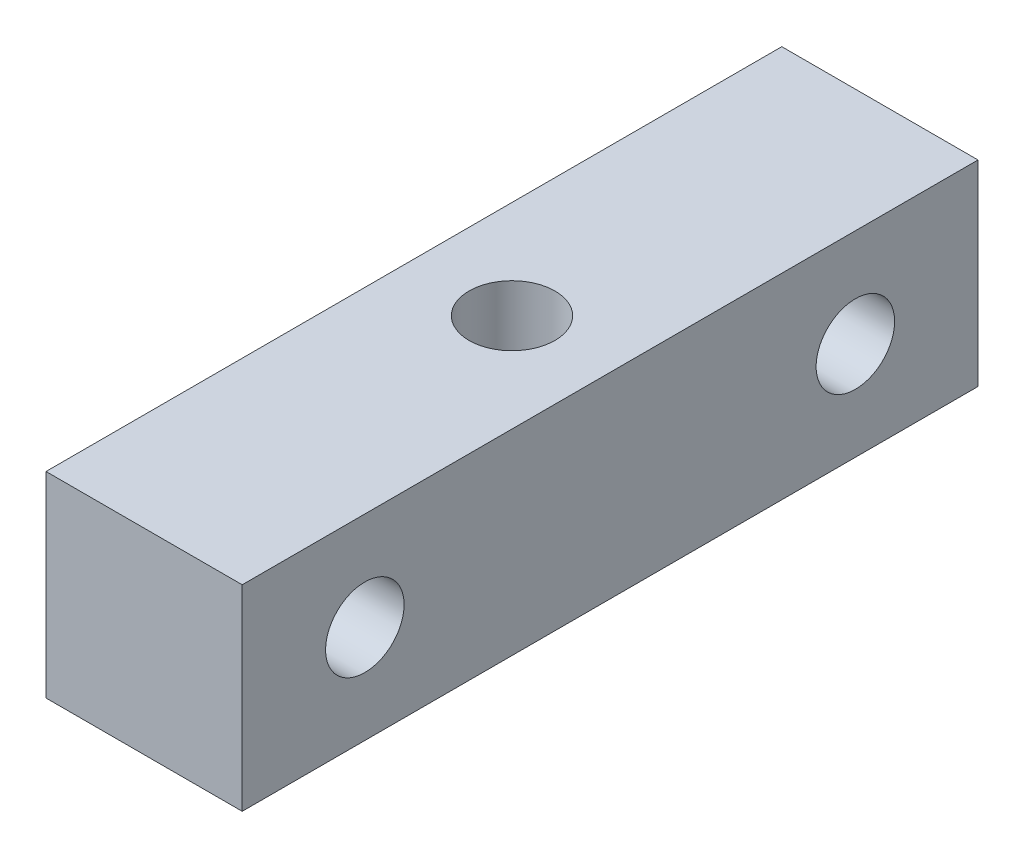
ISO-10303-21;
HEADER;
FILE_DESCRIPTION(('STEP AP214'),'2;1');
FILE_NAME('part.step','',(''),(''),'','','');
FILE_SCHEMA(('AUTOMOTIVE_DESIGN { 1 0 10303 214 1 1 1 1 }'));
ENDSEC;
DATA;
#1=APPLICATION_CONTEXT('core data for automotive mechanical design processes');
#2=APPLICATION_PROTOCOL_DEFINITION('international standard','automotive_design',2000,#1);
#3=PRODUCT_CONTEXT('',#1,'mechanical');
#4=PRODUCT('Part','Part','',(#3));
#5=PRODUCT_RELATED_PRODUCT_CATEGORY('part','',(#4));
#6=PRODUCT_DEFINITION_FORMATION('','',#4);
#7=PRODUCT_DEFINITION_CONTEXT('part definition',#1,'design');
#8=PRODUCT_DEFINITION('design','',#6,#7);
#9=PRODUCT_DEFINITION_SHAPE('','',#8);
#10=(LENGTH_UNIT() NAMED_UNIT(*) SI_UNIT(.MILLI.,.METRE.));
#11=(NAMED_UNIT(*) PLANE_ANGLE_UNIT() SI_UNIT($,.RADIAN.));
#12=(NAMED_UNIT(*) SI_UNIT($,.STERADIAN.) SOLID_ANGLE_UNIT());
#13=UNCERTAINTY_MEASURE_WITH_UNIT(LENGTH_MEASURE(1.E-05),#10,'distance_accuracy_value','');
#14=(GEOMETRIC_REPRESENTATION_CONTEXT(3) GLOBAL_UNCERTAINTY_ASSIGNED_CONTEXT((#13)) GLOBAL_UNIT_ASSIGNED_CONTEXT((#10,
#11,#12)) REPRESENTATION_CONTEXT('',''));
#15=CARTESIAN_POINT('',(0.,0.,0.));
#16=DIRECTION('',(0.,0.,1.));
#17=DIRECTION('',(1.,0.,0.));
#18=AXIS2_PLACEMENT_3D('',#15,#16,#17);
#19=CARTESIAN_POINT('',(4.,-4.,30.));
#20=DIRECTION('',(-1.,0.,0.));
#21=DIRECTION('',(0.,0.,1.));
#22=AXIS2_PLACEMENT_3D('',#19,#20,#21);
#23=PLANE('',#22);
#24=CARTESIAN_POINT('',(4.,0.,25.));
#25=DIRECTION('',(1.,0.,0.));
#26=DIRECTION('',(0.,0.,-1.));
#27=AXIS2_PLACEMENT_3D('',#24,#25,#26);
#28=CIRCLE('',#27,1.6);
#29=CARTESIAN_POINT('',(4.,0.,23.4));
#30=VERTEX_POINT('',#29);
#31=EDGE_CURVE('E149',#30,#30,#28,.T.);
#32=ORIENTED_EDGE('',*,*,#31,.F.);
#33=EDGE_LOOP('',(#32));
#34=FACE_BOUND('',#33,.T.);
#35=CARTESIAN_POINT('',(4.,0.,5.));
#36=DIRECTION('',(1.,0.,0.));
#37=DIRECTION('',(0.,0.,-1.));
#38=AXIS2_PLACEMENT_3D('',#35,#36,#37);
#39=CIRCLE('',#38,1.6);
#40=CARTESIAN_POINT('',(4.,0.,3.4));
#41=VERTEX_POINT('',#40);
#42=EDGE_CURVE('E145',#41,#41,#39,.T.);
#43=ORIENTED_EDGE('',*,*,#42,.F.);
#44=EDGE_LOOP('',(#43));
#45=FACE_BOUND('',#44,.T.);
#46=DIRECTION('',(0.,1.,0.));
#47=VECTOR('',#46,1.);
#48=CARTESIAN_POINT('',(4.,-4.,0.));
#49=LINE('',#48,#47);
#50=CARTESIAN_POINT('',(4.,-4.,0.));
#51=VERTEX_POINT('',#50);
#52=CARTESIAN_POINT('',(4.,4.,0.));
#53=VERTEX_POINT('',#52);
#54=EDGE_CURVE('E112',#51,#53,#49,.T.);
#55=ORIENTED_EDGE('',*,*,#54,.T.);
#56=DIRECTION('',(0.,0.,-1.));
#57=VECTOR('',#56,1.);
#58=CARTESIAN_POINT('',(4.,4.,30.));
#59=LINE('',#58,#57);
#60=CARTESIAN_POINT('',(4.,4.,30.));
#61=VERTEX_POINT('',#60);
#62=EDGE_CURVE('E11',#61,#53,#59,.T.);
#63=ORIENTED_EDGE('',*,*,#62,.F.);
#64=DIRECTION('',(0.,1.,0.));
#65=VECTOR('',#64,1.);
#66=CARTESIAN_POINT('',(4.,-4.,30.));
#67=LINE('',#66,#65);
#68=CARTESIAN_POINT('',(4.,-4.,30.));
#69=VERTEX_POINT('',#68);
#70=EDGE_CURVE('E96',#69,#61,#67,.T.);
#71=ORIENTED_EDGE('',*,*,#70,.F.);
#72=DIRECTION('',(0.,0.,-1.));
#73=VECTOR('',#72,1.);
#74=CARTESIAN_POINT('',(4.,-4.,30.));
#75=LINE('',#74,#73);
#76=EDGE_CURVE('E108',#69,#51,#75,.T.);
#77=ORIENTED_EDGE('',*,*,#76,.T.);
#78=EDGE_LOOP('',(#55,#63,#71,#77));
#79=FACE_BOUND('',#78,.T.);
#80=ADVANCED_FACE('F44',(#34,#45,#79),#23,.F.);
#81=CARTESIAN_POINT('',(-4.,4.,30.));
#82=DIRECTION('',(0.,-1.,0.));
#83=DIRECTION('',(0.,0.,-1.));
#84=AXIS2_PLACEMENT_3D('',#81,#82,#83);
#85=PLANE('',#84);
#86=CARTESIAN_POINT('',(0.,4.,15.));
#87=DIRECTION('',(0.,1.,0.));
#88=DIRECTION('',(0.,0.,1.));
#89=AXIS2_PLACEMENT_3D('',#86,#87,#88);
#90=CIRCLE('',#89,1.75);
#91=CARTESIAN_POINT('',(0.,4.,16.75));
#92=VERTEX_POINT('',#91);
#93=EDGE_CURVE('E133',#92,#92,#90,.T.);
#94=ORIENTED_EDGE('',*,*,#93,.F.);
#95=EDGE_LOOP('',(#94));
#96=FACE_BOUND('',#95,.T.);
#97=DIRECTION('',(-1.,0.,0.));
#98=VECTOR('',#97,1.);
#99=CARTESIAN_POINT('',(-4.,4.,0.));
#100=LINE('',#99,#98);
#101=CARTESIAN_POINT('',(-4.,4.,0.));
#102=VERTEX_POINT('',#101);
#103=EDGE_CURVE('E101',#53,#102,#100,.T.);
#104=ORIENTED_EDGE('',*,*,#103,.T.);
#105=DIRECTION('',(0.,0.,-1.));
#106=VECTOR('',#105,1.);
#107=CARTESIAN_POINT('',(-4.,4.,30.));
#108=LINE('',#107,#106);
#109=CARTESIAN_POINT('',(-4.,4.,30.));
#110=VERTEX_POINT('',#109);
#111=EDGE_CURVE('E53',#110,#102,#108,.T.);
#112=ORIENTED_EDGE('',*,*,#111,.F.);
#113=DIRECTION('',(-1.,0.,0.));
#114=VECTOR('',#113,1.);
#115=CARTESIAN_POINT('',(-4.,4.,30.));
#116=LINE('',#115,#114);
#117=EDGE_CURVE('E91',#61,#110,#116,.T.);
#118=ORIENTED_EDGE('',*,*,#117,.F.);
#119=ORIENTED_EDGE('',*,*,#62,.T.);
#120=EDGE_LOOP('',(#104,#112,#118,#119));
#121=FACE_BOUND('',#120,.T.);
#122=ADVANCED_FACE('F100',(#96,#121),#85,.F.);
#123=CARTESIAN_POINT('',(-4.,-4.,30.));
#124=DIRECTION('',(1.,0.,0.));
#125=DIRECTION('',(0.,0.,-1.));
#126=AXIS2_PLACEMENT_3D('',#123,#124,#125);
#127=PLANE('',#126);
#128=CARTESIAN_POINT('',(-4.,0.,25.));
#129=DIRECTION('',(1.,0.,0.));
#130=DIRECTION('',(0.,0.,-1.));
#131=AXIS2_PLACEMENT_3D('',#128,#129,#130);
#132=CIRCLE('',#131,1.6);
#133=CARTESIAN_POINT('',(-4.,0.,23.4));
#134=VERTEX_POINT('',#133);
#135=EDGE_CURVE('E137',#134,#134,#132,.T.);
#136=ORIENTED_EDGE('',*,*,#135,.T.);
#137=EDGE_LOOP('',(#136));
#138=FACE_BOUND('',#137,.T.);
#139=CARTESIAN_POINT('',(-4.,0.,5.));
#140=DIRECTION('',(1.,0.,0.));
#141=DIRECTION('',(0.,0.,-1.));
#142=AXIS2_PLACEMENT_3D('',#139,#140,#141);
#143=CIRCLE('',#142,1.6);
#144=CARTESIAN_POINT('',(-4.,0.,3.4));
#145=VERTEX_POINT('',#144);
#146=EDGE_CURVE('E141',#145,#145,#143,.T.);
#147=ORIENTED_EDGE('',*,*,#146,.T.);
#148=EDGE_LOOP('',(#147));
#149=FACE_BOUND('',#148,.T.);
#150=DIRECTION('',(0.,-1.,0.));
#151=VECTOR('',#150,1.);
#152=CARTESIAN_POINT('',(-4.,-4.,0.));
#153=LINE('',#152,#151);
#154=CARTESIAN_POINT('',(-4.,-4.,0.));
#155=VERTEX_POINT('',#154);
#156=EDGE_CURVE('E78',#102,#155,#153,.T.);
#157=ORIENTED_EDGE('',*,*,#156,.T.);
#158=DIRECTION('',(0.,0.,-1.));
#159=VECTOR('',#158,1.);
#160=CARTESIAN_POINT('',(-4.,-4.,30.));
#161=LINE('',#160,#159);
#162=CARTESIAN_POINT('',(-4.,-4.,30.));
#163=VERTEX_POINT('',#162);
#164=EDGE_CURVE('E103',#163,#155,#161,.T.);
#165=ORIENTED_EDGE('',*,*,#164,.F.);
#166=DIRECTION('',(0.,-1.,0.));
#167=VECTOR('',#166,1.);
#168=CARTESIAN_POINT('',(-4.,-4.,30.));
#169=LINE('',#168,#167);
#170=EDGE_CURVE('E94',#110,#163,#169,.T.);
#171=ORIENTED_EDGE('',*,*,#170,.F.);
#172=ORIENTED_EDGE('',*,*,#111,.T.);
#173=EDGE_LOOP('',(#157,#165,#171,#172));
#174=FACE_BOUND('',#173,.T.);
#175=ADVANCED_FACE('F104',(#138,#149,#174),#127,.F.);
#176=CARTESIAN_POINT('',(-4.,-4.,30.));
#177=DIRECTION('',(0.,1.,0.));
#178=DIRECTION('',(0.,0.,1.));
#179=AXIS2_PLACEMENT_3D('',#176,#177,#178);
#180=PLANE('',#179);
#181=CARTESIAN_POINT('',(0.,-4.,15.));
#182=DIRECTION('',(0.,1.,0.));
#183=DIRECTION('',(0.,0.,1.));
#184=AXIS2_PLACEMENT_3D('',#181,#182,#183);
#185=CIRCLE('',#184,1.75);
#186=CARTESIAN_POINT('',(0.,-4.,16.75));
#187=VERTEX_POINT('',#186);
#188=EDGE_CURVE('E116',#187,#187,#185,.T.);
#189=ORIENTED_EDGE('',*,*,#188,.T.);
#190=EDGE_LOOP('',(#189));
#191=FACE_BOUND('',#190,.T.);
#192=DIRECTION('',(1.,0.,0.));
#193=VECTOR('',#192,1.);
#194=CARTESIAN_POINT('',(-4.,-4.,0.));
#195=LINE('',#194,#193);
#196=EDGE_CURVE('E84',#155,#51,#195,.T.);
#197=ORIENTED_EDGE('',*,*,#196,.T.);
#198=ORIENTED_EDGE('',*,*,#76,.F.);
#199=DIRECTION('',(1.,0.,0.));
#200=VECTOR('',#199,1.);
#201=CARTESIAN_POINT('',(-4.,-4.,30.));
#202=LINE('',#201,#200);
#203=EDGE_CURVE('E61',#163,#69,#202,.T.);
#204=ORIENTED_EDGE('',*,*,#203,.F.);
#205=ORIENTED_EDGE('',*,*,#164,.T.);
#206=EDGE_LOOP('',(#197,#198,#204,#205));
#207=FACE_BOUND('',#206,.T.);
#208=ADVANCED_FACE('F126',(#191,#207),#180,.F.);
#209=CARTESIAN_POINT('',(0.,0.,30.));
#210=DIRECTION('',(0.,0.,-1.));
#211=DIRECTION('',(-1.,0.,0.));
#212=AXIS2_PLACEMENT_3D('',#209,#210,#211);
#213=PLANE('',#212);
#214=ORIENTED_EDGE('',*,*,#70,.T.);
#215=ORIENTED_EDGE('',*,*,#117,.T.);
#216=ORIENTED_EDGE('',*,*,#170,.T.);
#217=ORIENTED_EDGE('',*,*,#203,.T.);
#218=EDGE_LOOP('',(#214,#215,#216,#217));
#219=FACE_BOUND('',#218,.T.);
#220=ADVANCED_FACE('F92',(#219),#213,.F.);
#221=CARTESIAN_POINT('',(0.,0.,0.));
#222=DIRECTION('',(0.,0.,-1.));
#223=DIRECTION('',(-1.,0.,0.));
#224=AXIS2_PLACEMENT_3D('',#221,#222,#223);
#225=PLANE('',#224);
#226=ORIENTED_EDGE('',*,*,#54,.F.);
#227=ORIENTED_EDGE('',*,*,#196,.F.);
#228=ORIENTED_EDGE('',*,*,#156,.F.);
#229=ORIENTED_EDGE('',*,*,#103,.F.);
#230=EDGE_LOOP('',(#226,#227,#228,#229));
#231=FACE_BOUND('',#230,.T.);
#232=ADVANCED_FACE('F129',(#231),#225,.T.);
#233=CARTESIAN_POINT('',(0.,-4.,15.));
#234=DIRECTION('',(0.,1.,0.));
#235=DIRECTION('',(0.,0.,1.));
#236=AXIS2_PLACEMENT_3D('',#233,#234,#235);
#237=CYLINDRICAL_SURFACE('',#236,1.75);
#238=ORIENTED_EDGE('',*,*,#188,.F.);
#239=EDGE_LOOP('',(#238));
#240=FACE_BOUND('',#239,.T.);
#241=ORIENTED_EDGE('',*,*,#93,.T.);
#242=EDGE_LOOP('',(#241));
#243=FACE_BOUND('',#242,.T.);
#244=ADVANCED_FACE('F171',(#240,#243),#237,.F.);
#245=CARTESIAN_POINT('',(-4.,0.,5.));
#246=DIRECTION('',(1.,0.,0.));
#247=DIRECTION('',(0.,0.,-1.));
#248=AXIS2_PLACEMENT_3D('',#245,#246,#247);
#249=CYLINDRICAL_SURFACE('',#248,1.6);
#250=ORIENTED_EDGE('',*,*,#146,.F.);
#251=EDGE_LOOP('',(#250));
#252=FACE_BOUND('',#251,.T.);
#253=ORIENTED_EDGE('',*,*,#42,.T.);
#254=EDGE_LOOP('',(#253));
#255=FACE_BOUND('',#254,.T.);
#256=ADVANCED_FACE('F162',(#252,#255),#249,.F.);
#257=CARTESIAN_POINT('',(-4.,0.,25.));
#258=DIRECTION('',(1.,0.,0.));
#259=DIRECTION('',(0.,0.,-1.));
#260=AXIS2_PLACEMENT_3D('',#257,#258,#259);
#261=CYLINDRICAL_SURFACE('',#260,1.6);
#262=ORIENTED_EDGE('',*,*,#135,.F.);
#263=EDGE_LOOP('',(#262));
#264=FACE_BOUND('',#263,.T.);
#265=ORIENTED_EDGE('',*,*,#31,.T.);
#266=EDGE_LOOP('',(#265));
#267=FACE_BOUND('',#266,.T.);
#268=ADVANCED_FACE('F159',(#264,#267),#261,.F.);
#269=CLOSED_SHELL('',(#80,#122,#175,#208,#220,#232,#244,#256,#268));
#270=MANIFOLD_SOLID_BREP('B2',#269);
#271=ADVANCED_BREP_SHAPE_REPRESENTATION('',(#18,#270),#14);
#272=SHAPE_DEFINITION_REPRESENTATION(#9,#271);
ENDSEC;
END-ISO-10303-21;
